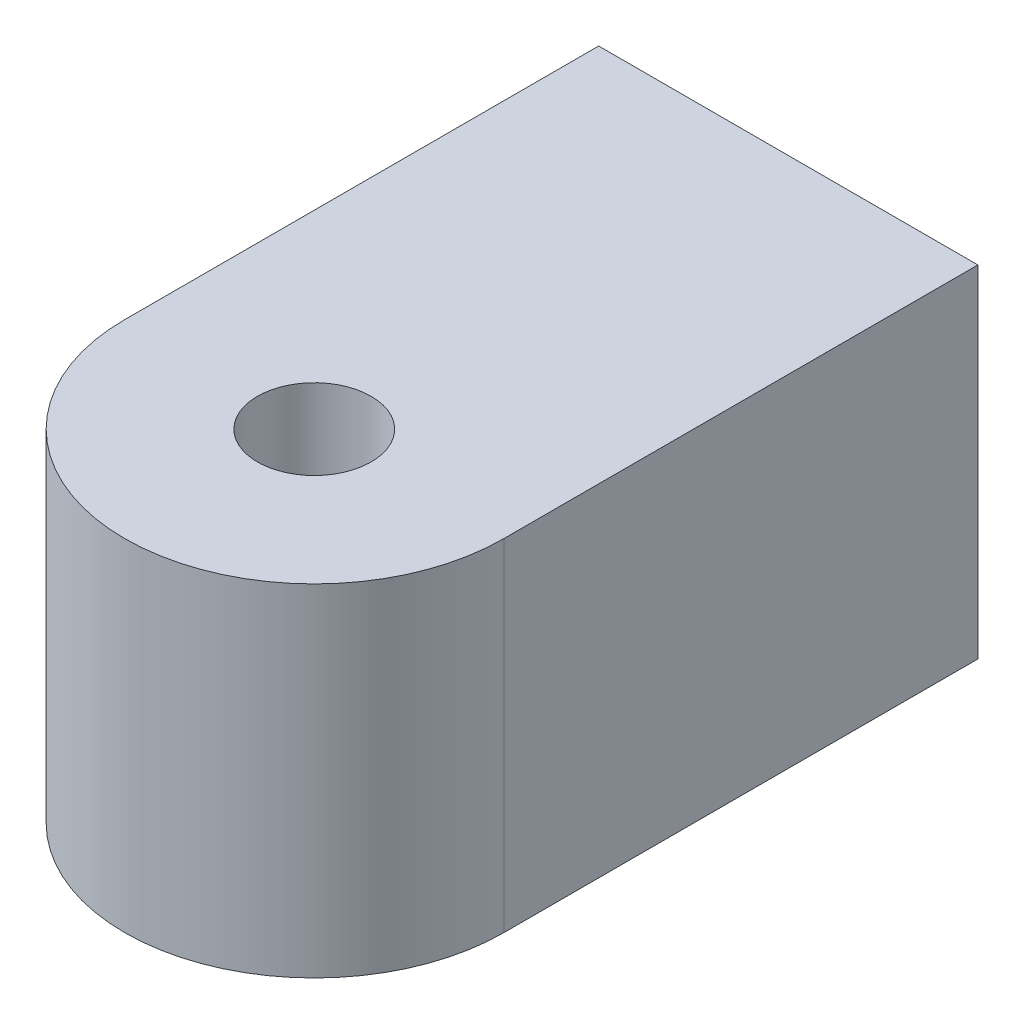
ISO-10303-21;
HEADER;
FILE_DESCRIPTION(('STEP AP214'),'2;1');
FILE_NAME('part.step','',(''),(''),'','','');
FILE_SCHEMA(('AUTOMOTIVE_DESIGN { 1 0 10303 214 1 1 1 1 }'));
ENDSEC;
DATA;
#1=APPLICATION_CONTEXT('core data for automotive mechanical design processes');
#2=APPLICATION_PROTOCOL_DEFINITION('international standard','automotive_design',2000,#1);
#3=PRODUCT_CONTEXT('',#1,'mechanical');
#4=PRODUCT('Part','Part','',(#3));
#5=PRODUCT_RELATED_PRODUCT_CATEGORY('part','',(#4));
#6=PRODUCT_DEFINITION_FORMATION('','',#4);
#7=PRODUCT_DEFINITION_CONTEXT('part definition',#1,'design');
#8=PRODUCT_DEFINITION('design','',#6,#7);
#9=PRODUCT_DEFINITION_SHAPE('','',#8);
#10=(LENGTH_UNIT() NAMED_UNIT(*) SI_UNIT(.MILLI.,.METRE.));
#11=(NAMED_UNIT(*) PLANE_ANGLE_UNIT() SI_UNIT($,.RADIAN.));
#12=(NAMED_UNIT(*) SI_UNIT($,.STERADIAN.) SOLID_ANGLE_UNIT());
#13=UNCERTAINTY_MEASURE_WITH_UNIT(LENGTH_MEASURE(1.E-05),#10,'distance_accuracy_value','');
#14=(GEOMETRIC_REPRESENTATION_CONTEXT(3) GLOBAL_UNCERTAINTY_ASSIGNED_CONTEXT((#13)) GLOBAL_UNIT_ASSIGNED_CONTEXT((#10,
#11,#12)) REPRESENTATION_CONTEXT('',''));
#15=CARTESIAN_POINT('',(0.,0.,0.));
#16=DIRECTION('',(0.,0.,1.));
#17=DIRECTION('',(1.,0.,0.));
#18=AXIS2_PLACEMENT_3D('',#15,#16,#17);
#19=CARTESIAN_POINT('',(0.,90.,0.));
#20=DIRECTION('',(0.,1.,0.));
#21=DIRECTION('',(0.,0.,1.));
#22=AXIS2_PLACEMENT_3D('',#19,#20,#21);
#23=PLANE('',#22);
#24=CARTESIAN_POINT('',(0.,90.,0.));
#25=DIRECTION('',(0.,1.,0.));
#26=DIRECTION('',(0.,0.,1.));
#27=AXIS2_PLACEMENT_3D('',#24,#25,#26);
#28=CIRCLE('',#27,50.);
#29=CARTESIAN_POINT('',(-50.,90.,0.));
#30=VERTEX_POINT('',#29);
#31=CARTESIAN_POINT('',(50.,90.,0.));
#32=VERTEX_POINT('',#31);
#33=EDGE_CURVE('E55',#30,#32,#28,.T.);
#34=ORIENTED_EDGE('',*,*,#33,.T.);
#35=DIRECTION('',(0.,0.,-1.));
#36=VECTOR('',#35,1.);
#37=CARTESIAN_POINT('',(50.,90.,-125.));
#38=LINE('',#37,#36);
#39=CARTESIAN_POINT('',(50.,90.,-125.));
#40=VERTEX_POINT('',#39);
#41=EDGE_CURVE('E92',#32,#40,#38,.T.);
#42=ORIENTED_EDGE('',*,*,#41,.T.);
#43=DIRECTION('',(-1.,0.,0.));
#44=VECTOR('',#43,1.);
#45=CARTESIAN_POINT('',(-50.,90.,-125.));
#46=LINE('',#45,#44);
#47=CARTESIAN_POINT('',(-50.,90.,-125.));
#48=VERTEX_POINT('',#47);
#49=EDGE_CURVE('E101',#40,#48,#46,.T.);
#50=ORIENTED_EDGE('',*,*,#49,.T.);
#51=DIRECTION('',(0.,0.,1.));
#52=VECTOR('',#51,1.);
#53=CARTESIAN_POINT('',(-50.,90.,0.));
#54=LINE('',#53,#52);
#55=EDGE_CURVE('E108',#48,#30,#54,.T.);
#56=ORIENTED_EDGE('',*,*,#55,.T.);
#57=EDGE_LOOP('',(#34,#42,#50,#56));
#58=FACE_BOUND('',#57,.T.);
#59=CARTESIAN_POINT('',(0.,90.,0.));
#60=DIRECTION('',(0.,1.,0.));
#61=DIRECTION('',(0.,0.,1.));
#62=AXIS2_PLACEMENT_3D('',#59,#60,#61);
#63=CIRCLE('',#62,15.);
#64=CARTESIAN_POINT('',(0.,90.,-15.));
#65=VERTEX_POINT('',#64);
#66=EDGE_CURVE('E134',#65,#65,#63,.T.);
#67=ORIENTED_EDGE('',*,*,#66,.F.);
#68=EDGE_LOOP('',(#67));
#69=FACE_BOUND('',#68,.T.);
#70=ADVANCED_FACE('F45',(#58,#69),#23,.T.);
#71=CARTESIAN_POINT('',(0.,0.,0.));
#72=DIRECTION('',(0.,1.,0.));
#73=DIRECTION('',(0.,0.,1.));
#74=AXIS2_PLACEMENT_3D('',#71,#72,#73);
#75=PLANE('',#74);
#76=CARTESIAN_POINT('',(0.,0.,0.));
#77=DIRECTION('',(0.,1.,0.));
#78=DIRECTION('',(0.,0.,1.));
#79=AXIS2_PLACEMENT_3D('',#76,#77,#78);
#80=CIRCLE('',#79,50.);
#81=CARTESIAN_POINT('',(-50.,0.,0.));
#82=VERTEX_POINT('',#81);
#83=CARTESIAN_POINT('',(50.,0.,0.));
#84=VERTEX_POINT('',#83);
#85=EDGE_CURVE('E49',#82,#84,#80,.T.);
#86=ORIENTED_EDGE('',*,*,#85,.F.);
#87=DIRECTION('',(0.,0.,-1.));
#88=VECTOR('',#87,1.);
#89=CARTESIAN_POINT('',(-50.,0.,0.));
#90=LINE('',#89,#88);
#91=CARTESIAN_POINT('',(-50.,0.,-125.));
#92=VERTEX_POINT('',#91);
#93=EDGE_CURVE('E118',#82,#92,#90,.T.);
#94=ORIENTED_EDGE('',*,*,#93,.T.);
#95=DIRECTION('',(1.,0.,0.));
#96=VECTOR('',#95,1.);
#97=CARTESIAN_POINT('',(-50.,0.,-125.));
#98=LINE('',#97,#96);
#99=CARTESIAN_POINT('',(50.,0.,-125.));
#100=VERTEX_POINT('',#99);
#101=EDGE_CURVE('E126',#92,#100,#98,.T.);
#102=ORIENTED_EDGE('',*,*,#101,.T.);
#103=DIRECTION('',(0.,0.,1.));
#104=VECTOR('',#103,1.);
#105=CARTESIAN_POINT('',(50.,0.,-125.));
#106=LINE('',#105,#104);
#107=EDGE_CURVE('E93',#100,#84,#106,.T.);
#108=ORIENTED_EDGE('',*,*,#107,.T.);
#109=EDGE_LOOP('',(#86,#94,#102,#108));
#110=FACE_BOUND('',#109,.T.);
#111=CARTESIAN_POINT('',(0.,0.,0.));
#112=DIRECTION('',(0.,1.,0.));
#113=DIRECTION('',(0.,0.,1.));
#114=AXIS2_PLACEMENT_3D('',#111,#112,#113);
#115=CIRCLE('',#114,15.);
#116=CARTESIAN_POINT('',(0.,0.,-15.));
#117=VERTEX_POINT('',#116);
#118=EDGE_CURVE('E133',#117,#117,#115,.T.);
#119=ORIENTED_EDGE('',*,*,#118,.T.);
#120=EDGE_LOOP('',(#119));
#121=FACE_BOUND('',#120,.T.);
#122=ADVANCED_FACE('F145',(#110,#121),#75,.F.);
#123=CARTESIAN_POINT('',(0.,90.,0.));
#124=DIRECTION('',(0.,-1.,0.));
#125=DIRECTION('',(0.,0.,-1.));
#126=AXIS2_PLACEMENT_3D('',#123,#124,#125);
#127=CYLINDRICAL_SURFACE('',#126,50.);
#128=ORIENTED_EDGE('',*,*,#33,.F.);
#129=DIRECTION('',(0.,1.,0.));
#130=VECTOR('',#129,1.);
#131=CARTESIAN_POINT('',(-50.,-160.078105935821,0.));
#132=LINE('',#131,#130);
#133=EDGE_CURVE('E123',#82,#30,#132,.T.);
#134=ORIENTED_EDGE('',*,*,#133,.F.);
#135=ORIENTED_EDGE('',*,*,#85,.T.);
#136=DIRECTION('',(0.,1.,0.));
#137=VECTOR('',#136,1.);
#138=CARTESIAN_POINT('',(50.,-160.078105935821,0.));
#139=LINE('',#138,#137);
#140=EDGE_CURVE('E98',#84,#32,#139,.T.);
#141=ORIENTED_EDGE('',*,*,#140,.T.);
#142=EDGE_LOOP('',(#128,#134,#135,#141));
#143=FACE_BOUND('',#142,.T.);
#144=ADVANCED_FACE('F47',(#143),#127,.T.);
#145=CARTESIAN_POINT('',(0.,90.,0.));
#146=DIRECTION('',(0.,-1.,0.));
#147=DIRECTION('',(0.,0.,-1.));
#148=AXIS2_PLACEMENT_3D('',#145,#146,#147);
#149=CYLINDRICAL_SURFACE('',#148,15.);
#150=CARTESIAN_POINT('',(0.,90.,-15.));
#151=CARTESIAN_POINT('',(0.,89.0625,-15.));
#152=CARTESIAN_POINT('',(0.,88.125,-15.));
#153=CARTESIAN_POINT('',(0.,86.25,-15.));
#154=CARTESIAN_POINT('',(0.,85.3125,-15.));
#155=CARTESIAN_POINT('',(0.,83.4375,-15.));
#156=CARTESIAN_POINT('',(0.,82.5,-15.));
#157=CARTESIAN_POINT('',(0.,80.625,-15.));
#158=CARTESIAN_POINT('',(0.,79.6875,-15.));
#159=CARTESIAN_POINT('',(0.,77.8125,-15.));
#160=CARTESIAN_POINT('',(0.,76.875,-15.));
#161=CARTESIAN_POINT('',(0.,75.,-15.));
#162=CARTESIAN_POINT('',(0.,74.0625,-15.));
#163=CARTESIAN_POINT('',(0.,72.1875,-15.));
#164=CARTESIAN_POINT('',(0.,71.25,-15.));
#165=CARTESIAN_POINT('',(0.,69.375,-15.));
#166=CARTESIAN_POINT('',(0.,68.4375,-15.));
#167=CARTESIAN_POINT('',(0.,66.5625,-15.));
#168=CARTESIAN_POINT('',(0.,65.625,-15.));
#169=CARTESIAN_POINT('',(0.,63.75,-15.));
#170=CARTESIAN_POINT('',(0.,62.8125,-15.));
#171=CARTESIAN_POINT('',(0.,60.9375,-15.));
#172=CARTESIAN_POINT('',(0.,60.,-15.));
#173=CARTESIAN_POINT('',(0.,58.125,-15.));
#174=CARTESIAN_POINT('',(0.,57.1875,-15.));
#175=CARTESIAN_POINT('',(0.,55.3125,-15.));
#176=CARTESIAN_POINT('',(0.,54.375,-15.));
#177=CARTESIAN_POINT('',(0.,52.5,-15.));
#178=CARTESIAN_POINT('',(0.,51.5625,-15.));
#179=CARTESIAN_POINT('',(0.,49.6875,-15.));
#180=CARTESIAN_POINT('',(0.,48.75,-15.));
#181=CARTESIAN_POINT('',(0.,46.875,-15.));
#182=CARTESIAN_POINT('',(0.,45.9375,-15.));
#183=CARTESIAN_POINT('',(0.,44.0625,-15.));
#184=CARTESIAN_POINT('',(0.,43.125,-15.));
#185=CARTESIAN_POINT('',(0.,41.25,-15.));
#186=CARTESIAN_POINT('',(0.,40.3125,-15.));
#187=CARTESIAN_POINT('',(0.,38.4375,-15.));
#188=CARTESIAN_POINT('',(0.,37.5,-15.));
#189=CARTESIAN_POINT('',(0.,35.625,-15.));
#190=CARTESIAN_POINT('',(0.,34.6875,-15.));
#191=CARTESIAN_POINT('',(0.,32.8125,-15.));
#192=CARTESIAN_POINT('',(0.,31.875,-15.));
#193=CARTESIAN_POINT('',(0.,30.,-15.));
#194=CARTESIAN_POINT('',(0.,29.0625,-15.));
#195=CARTESIAN_POINT('',(0.,27.1875,-15.));
#196=CARTESIAN_POINT('',(0.,26.25,-15.));
#197=CARTESIAN_POINT('',(0.,24.375,-15.));
#198=CARTESIAN_POINT('',(0.,23.4375,-15.));
#199=CARTESIAN_POINT('',(0.,21.5625,-15.));
#200=CARTESIAN_POINT('',(0.,20.625,-15.));
#201=CARTESIAN_POINT('',(0.,18.75,-15.));
#202=CARTESIAN_POINT('',(0.,17.8125,-15.));
#203=CARTESIAN_POINT('',(0.,15.9375,-15.));
#204=CARTESIAN_POINT('',(0.,15.,-15.));
#205=CARTESIAN_POINT('',(0.,13.125,-15.));
#206=CARTESIAN_POINT('',(0.,12.1875,-15.));
#207=CARTESIAN_POINT('',(0.,10.3125,-15.));
#208=CARTESIAN_POINT('',(0.,9.37499999999999,-15.));
#209=CARTESIAN_POINT('',(0.,7.49999999999999,-15.));
#210=CARTESIAN_POINT('',(0.,6.56249999999999,-15.));
#211=CARTESIAN_POINT('',(0.,4.68749999999999,-15.));
#212=CARTESIAN_POINT('',(0.,3.74999999999998,-15.));
#213=CARTESIAN_POINT('',(0.,1.87499999999998,-15.));
#214=CARTESIAN_POINT('',(0.,0.937499999999986,-15.));
#215=CARTESIAN_POINT('',(0.,0.,-15.));
#216=B_SPLINE_CURVE_WITH_KNOTS('',3,(#150,#151,#152,#153,#154,#155,#156,#157,#158,#159,#160,
#161,#162,#163,#164,#165,#166,#167,#168,#169,#170,#171,#172,#173,#174,#175,#176,#177,#178,#179,
#180,#181,#182,#183,#184,#185,#186,#187,#188,#189,#190,#191,#192,#193,#194,#195,#196,#197,#198,
#199,#200,#201,#202,#203,#204,#205,#206,#207,#208,#209,#210,#211,#212,#213,#214,#215),
.UNSPECIFIED.,.F.,.F.,(4,2,2,2,2,2,2,2,2,2,2,2,2,2,2,2,2,2,2,2,2,2,2,2,2,2,2,2,2,2,2,2,4),(0.,
2.8125,5.62499999999999,8.43749999999999,11.25,14.0625,16.875,19.6875,22.5,25.3125,28.125,
30.9375,33.75,36.5625,39.375,42.1875,45.,47.8125,50.625,53.4375,56.25,59.0625,61.875,64.6875,
67.5,70.3125,73.125,75.9375,78.75,81.5625,84.375,87.1875,90.),.UNSPECIFIED.);
#217=EDGE_CURVE('BSEAM151',#65,#117,#216,.T.);
#218=ORIENTED_EDGE('',*,*,#66,.T.);
#219=ORIENTED_EDGE('',*,*,#118,.F.);
#220=ORIENTED_EDGE('',*,*,#217,.T.);
#221=ORIENTED_EDGE('',*,*,#217,.F.);
#222=EDGE_LOOP('',(#218,#220,#219,#221));
#223=FACE_BOUND('',#222,.T.);
#224=ADVANCED_FACE('F151',(#223),#149,.F.);
#225=CARTESIAN_POINT('',(-50.,-160.078105935821,0.));
#226=DIRECTION('',(-1.,0.,0.));
#227=DIRECTION('',(0.,0.,1.));
#228=AXIS2_PLACEMENT_3D('',#225,#226,#227);
#229=PLANE('',#228);
#230=ORIENTED_EDGE('',*,*,#93,.F.);
#231=ORIENTED_EDGE('',*,*,#133,.T.);
#232=ORIENTED_EDGE('',*,*,#55,.F.);
#233=DIRECTION('',(0.,1.,0.));
#234=VECTOR('',#233,1.);
#235=CARTESIAN_POINT('',(-50.,-160.078105935821,-125.));
#236=LINE('',#235,#234);
#237=EDGE_CURVE('E97',#92,#48,#236,.T.);
#238=ORIENTED_EDGE('',*,*,#237,.F.);
#239=EDGE_LOOP('',(#230,#231,#232,#238));
#240=FACE_BOUND('',#239,.T.);
#241=ADVANCED_FACE('F149',(#240),#229,.T.);
#242=CARTESIAN_POINT('',(-50.,-160.078105935821,-125.));
#243=DIRECTION('',(0.,0.,-1.));
#244=DIRECTION('',(-1.,0.,0.));
#245=AXIS2_PLACEMENT_3D('',#242,#243,#244);
#246=PLANE('',#245);
#247=CARTESIAN_POINT('',(0.,47.9762322043282,-125.));
#248=DIRECTION('',(0.,0.,-1.));
#249=DIRECTION('',(-1.,0.,0.));
#250=AXIS2_PLACEMENT_3D('',#247,#248,#249);
#251=CIRCLE('',#250,15.);
#252=CARTESIAN_POINT('',(-15.,47.9762322043282,-125.));
#253=VERTEX_POINT('',#252);
#254=EDGE_CURVE('E11',#253,#253,#251,.T.);
#255=ORIENTED_EDGE('',*,*,#254,.F.);
#256=EDGE_LOOP('',(#255));
#257=FACE_BOUND('',#256,.T.);
#258=ORIENTED_EDGE('',*,*,#101,.F.);
#259=ORIENTED_EDGE('',*,*,#237,.T.);
#260=ORIENTED_EDGE('',*,*,#49,.F.);
#261=DIRECTION('',(0.,1.,0.));
#262=VECTOR('',#261,1.);
#263=CARTESIAN_POINT('',(50.,-160.078105935821,-125.));
#264=LINE('',#263,#262);
#265=EDGE_CURVE('E87',#100,#40,#264,.T.);
#266=ORIENTED_EDGE('',*,*,#265,.F.);
#267=EDGE_LOOP('',(#258,#259,#260,#266));
#268=FACE_BOUND('',#267,.T.);
#269=ADVANCED_FACE('F102',(#257,#268),#246,.T.);
#270=CARTESIAN_POINT('',(50.,-160.078105935821,-125.));
#271=DIRECTION('',(1.,0.,0.));
#272=DIRECTION('',(0.,0.,-1.));
#273=AXIS2_PLACEMENT_3D('',#270,#271,#272);
#274=PLANE('',#273);
#275=ORIENTED_EDGE('',*,*,#107,.F.);
#276=ORIENTED_EDGE('',*,*,#265,.T.);
#277=ORIENTED_EDGE('',*,*,#41,.F.);
#278=ORIENTED_EDGE('',*,*,#140,.F.);
#279=EDGE_LOOP('',(#275,#276,#277,#278));
#280=FACE_BOUND('',#279,.T.);
#281=ADVANCED_FACE('F89',(#280),#274,.T.);
#282=CARTESIAN_POINT('',(0.,47.9762322043282,-150.));
#283=DIRECTION('',(0.,0.,1.));
#284=DIRECTION('',(1.,0.,0.));
#285=AXIS2_PLACEMENT_3D('',#282,#283,#284);
#286=CYLINDRICAL_SURFACE('',#285,15.);
#287=CARTESIAN_POINT('',(0.,47.9762322043282,-150.));
#288=DIRECTION('',(0.,0.,-1.));
#289=DIRECTION('',(-1.,0.,0.));
#290=AXIS2_PLACEMENT_3D('',#287,#288,#289);
#291=CIRCLE('',#290,15.);
#292=CARTESIAN_POINT('',(-15.,47.9762322043282,-150.));
#293=VERTEX_POINT('',#292);
#294=EDGE_CURVE('E112',#293,#293,#291,.T.);
#295=ORIENTED_EDGE('',*,*,#294,.F.);
#296=EDGE_LOOP('',(#295));
#297=FACE_BOUND('',#296,.T.);
#298=ORIENTED_EDGE('',*,*,#254,.T.);
#299=EDGE_LOOP('',(#298));
#300=FACE_BOUND('',#299,.T.);
#301=ADVANCED_FACE('F166',(#297,#300),#286,.T.);
#302=CARTESIAN_POINT('',(0.,47.9762322043282,-150.));
#303=DIRECTION('',(0.,0.,-1.));
#304=DIRECTION('',(-1.,0.,0.));
#305=AXIS2_PLACEMENT_3D('',#302,#303,#304);
#306=PLANE('',#305);
#307=ORIENTED_EDGE('',*,*,#294,.T.);
#308=EDGE_LOOP('',(#307));
#309=FACE_BOUND('',#308,.T.);
#310=ADVANCED_FACE('F173',(#309),#306,.T.);
#311=CLOSED_SHELL('',(#70,#122,#144,#224,#241,#269,#281,#301,#310));
#312=MANIFOLD_SOLID_BREP('B2',#311);
#313=ADVANCED_BREP_SHAPE_REPRESENTATION('',(#18,#312),#14);
#314=SHAPE_DEFINITION_REPRESENTATION(#9,#313);
ENDSEC;
END-ISO-10303-21;
